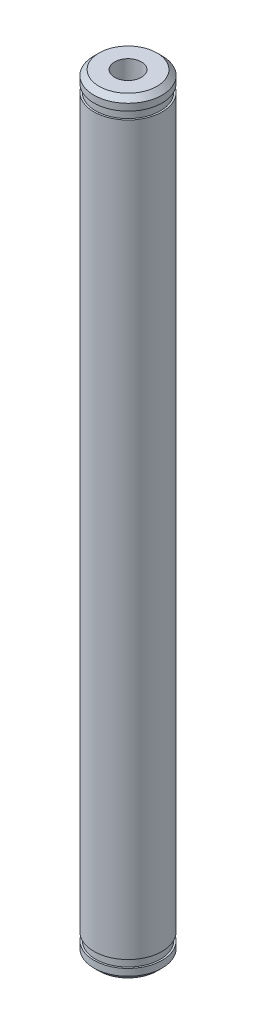
ISO-10303-21;
HEADER;
FILE_DESCRIPTION(('STEP AP214'),'2;1');
FILE_NAME('part.step','',(''),(''),'','','');
FILE_SCHEMA(('AUTOMOTIVE_DESIGN { 1 0 10303 214 1 1 1 1 }'));
ENDSEC;
DATA;
#1=APPLICATION_CONTEXT('core data for automotive mechanical design processes');
#2=APPLICATION_PROTOCOL_DEFINITION('international standard','automotive_design',2000,#1);
#3=PRODUCT_CONTEXT('',#1,'mechanical');
#4=PRODUCT('Part','Part','',(#3));
#5=PRODUCT_RELATED_PRODUCT_CATEGORY('part','',(#4));
#6=PRODUCT_DEFINITION_FORMATION('','',#4);
#7=PRODUCT_DEFINITION_CONTEXT('part definition',#1,'design');
#8=PRODUCT_DEFINITION('design','',#6,#7);
#9=PRODUCT_DEFINITION_SHAPE('','',#8);
#10=(LENGTH_UNIT() NAMED_UNIT(*) SI_UNIT(.MILLI.,.METRE.));
#11=(NAMED_UNIT(*) PLANE_ANGLE_UNIT() SI_UNIT($,.RADIAN.));
#12=(NAMED_UNIT(*) SI_UNIT($,.STERADIAN.) SOLID_ANGLE_UNIT());
#13=UNCERTAINTY_MEASURE_WITH_UNIT(LENGTH_MEASURE(1.E-05),#10,'distance_accuracy_value','');
#14=(GEOMETRIC_REPRESENTATION_CONTEXT(3) GLOBAL_UNCERTAINTY_ASSIGNED_CONTEXT((#13)) GLOBAL_UNIT_ASSIGNED_CONTEXT((#10,
#11,#12)) REPRESENTATION_CONTEXT('',''));
#15=CARTESIAN_POINT('',(0.,0.,0.));
#16=DIRECTION('',(0.,0.,1.));
#17=DIRECTION('',(1.,0.,0.));
#18=AXIS2_PLACEMENT_3D('',#15,#16,#17);
#19=CARTESIAN_POINT('',(0.,90.,0.));
#20=DIRECTION('',(0.,-1.,0.));
#21=DIRECTION('',(0.,0.,-1.));
#22=AXIS2_PLACEMENT_3D('',#19,#20,#21);
#23=CYLINDRICAL_SURFACE('',#22,4.);
#24=CARTESIAN_POINT('',(0.,2.3,0.));
#25=DIRECTION('',(0.,-1.,0.));
#26=DIRECTION('',(0.,0.,-1.));
#27=AXIS2_PLACEMENT_3D('',#24,#25,#26);
#28=CIRCLE('',#27,4.);
#29=CARTESIAN_POINT('',(0.,2.30000000000001,-4.));
#30=VERTEX_POINT('',#29);
#31=EDGE_CURVE('E70',#30,#30,#28,.T.);
#32=CARTESIAN_POINT('',(0.,87.7,0.));
#33=DIRECTION('',(0.,-1.,0.));
#34=DIRECTION('',(0.,0.,-1.));
#35=AXIS2_PLACEMENT_3D('',#32,#33,#34);
#36=CIRCLE('',#35,4.);
#37=CARTESIAN_POINT('',(0.,87.7,-4.));
#38=VERTEX_POINT('',#37);
#39=EDGE_CURVE('E94',#38,#38,#36,.T.);
#40=CARTESIAN_POINT('',(0.,2.30000000000001,-4.));
#41=CARTESIAN_POINT('',(0.,3.18958333333334,-4.));
#42=CARTESIAN_POINT('',(0.,4.07916666666668,-4.));
#43=CARTESIAN_POINT('',(0.,5.85833333333334,-4.));
#44=CARTESIAN_POINT('',(0.,6.74791666666667,-4.));
#45=CARTESIAN_POINT('',(0.,8.52708333333334,-4.));
#46=CARTESIAN_POINT('',(0.,9.41666666666667,-4.));
#47=CARTESIAN_POINT('',(0.,11.1958333333333,-4.));
#48=CARTESIAN_POINT('',(0.,12.0854166666667,-4.));
#49=CARTESIAN_POINT('',(0.,13.8645833333333,-4.));
#50=CARTESIAN_POINT('',(0.,14.7541666666667,-4.));
#51=CARTESIAN_POINT('',(0.,16.5333333333333,-4.));
#52=CARTESIAN_POINT('',(0.,17.4229166666667,-4.));
#53=CARTESIAN_POINT('',(0.,19.2020833333333,-4.));
#54=CARTESIAN_POINT('',(0.,20.0916666666667,-4.));
#55=CARTESIAN_POINT('',(0.,21.8708333333333,-4.));
#56=CARTESIAN_POINT('',(0.,22.7604166666667,-4.));
#57=CARTESIAN_POINT('',(0.,24.5395833333334,-4.));
#58=CARTESIAN_POINT('',(0.,25.4291666666667,-4.));
#59=CARTESIAN_POINT('',(0.,27.2083333333333,-4.));
#60=CARTESIAN_POINT('',(0.,28.0979166666667,-4.));
#61=CARTESIAN_POINT('',(0.,29.8770833333333,-4.));
#62=CARTESIAN_POINT('',(0.,30.7666666666667,-4.));
#63=CARTESIAN_POINT('',(0.,32.5458333333333,-4.));
#64=CARTESIAN_POINT('',(0.,33.4354166666667,-4.));
#65=CARTESIAN_POINT('',(0.,35.2145833333333,-4.));
#66=CARTESIAN_POINT('',(0.,36.1041666666667,-4.));
#67=CARTESIAN_POINT('',(0.,37.8833333333333,-4.));
#68=CARTESIAN_POINT('',(0.,38.7729166666667,-4.));
#69=CARTESIAN_POINT('',(0.,40.5520833333333,-4.));
#70=CARTESIAN_POINT('',(0.,41.4416666666667,-4.));
#71=CARTESIAN_POINT('',(0.,43.2208333333333,-4.));
#72=CARTESIAN_POINT('',(0.,44.1104166666667,-4.));
#73=CARTESIAN_POINT('',(0.,45.8895833333333,-4.));
#74=CARTESIAN_POINT('',(0.,46.7791666666667,-4.));
#75=CARTESIAN_POINT('',(0.,48.5583333333333,-4.));
#76=CARTESIAN_POINT('',(0.,49.4479166666667,-4.));
#77=CARTESIAN_POINT('',(0.,51.2270833333333,-4.));
#78=CARTESIAN_POINT('',(0.,52.1166666666667,-4.));
#79=CARTESIAN_POINT('',(0.,53.8958333333333,-4.));
#80=CARTESIAN_POINT('',(0.,54.7854166666667,-4.));
#81=CARTESIAN_POINT('',(0.,56.5645833333333,-4.));
#82=CARTESIAN_POINT('',(0.,57.4541666666667,-4.));
#83=CARTESIAN_POINT('',(0.,59.2333333333333,-4.));
#84=CARTESIAN_POINT('',(0.,60.1229166666667,-4.));
#85=CARTESIAN_POINT('',(0.,61.9020833333333,-4.));
#86=CARTESIAN_POINT('',(0.,62.7916666666667,-4.));
#87=CARTESIAN_POINT('',(0.,64.5708333333333,-4.));
#88=CARTESIAN_POINT('',(0.,65.4604166666667,-4.));
#89=CARTESIAN_POINT('',(0.,67.2395833333333,-4.));
#90=CARTESIAN_POINT('',(0.,68.1291666666667,-4.));
#91=CARTESIAN_POINT('',(0.,69.9083333333333,-4.));
#92=CARTESIAN_POINT('',(0.,70.7979166666667,-4.));
#93=CARTESIAN_POINT('',(0.,72.5770833333333,-4.));
#94=CARTESIAN_POINT('',(0.,73.4666666666667,-4.));
#95=CARTESIAN_POINT('',(0.,75.2458333333333,-4.));
#96=CARTESIAN_POINT('',(0.,76.1354166666667,-4.));
#97=CARTESIAN_POINT('',(0.,77.9145833333333,-4.));
#98=CARTESIAN_POINT('',(0.,78.8041666666667,-4.));
#99=CARTESIAN_POINT('',(0.,80.5833333333333,-4.));
#100=CARTESIAN_POINT('',(0.,81.4729166666667,-4.));
#101=CARTESIAN_POINT('',(0.,83.2520833333333,-4.));
#102=CARTESIAN_POINT('',(0.,84.1416666666667,-4.));
#103=CARTESIAN_POINT('',(0.,85.9208333333333,-4.));
#104=CARTESIAN_POINT('',(0.,86.8104166666667,-4.));
#105=CARTESIAN_POINT('',(0.,87.7,-4.));
#106=B_SPLINE_CURVE_WITH_KNOTS('',3,(#40,#41,#42,#43,#44,#45,#46,#47,#48,#49,#50,#51,#52,#53,
#54,#55,#56,#57,#58,#59,#60,#61,#62,#63,#64,#65,#66,#67,#68,#69,#70,#71,#72,#73,#74,#75,#76,#77,
#78,#79,#80,#81,#82,#83,#84,#85,#86,#87,#88,#89,#90,#91,#92,#93,#94,#95,#96,#97,#98,#99,#100,
#101,#102,#103,#104,#105),.UNSPECIFIED.,.F.,.F.,(4,2,2,2,2,2,2,2,2,2,2,2,2,2,2,2,2,2,2,2,2,2,2,
2,2,2,2,2,2,2,2,2,4),(0.,2.66875,5.3375,8.00624999999999,10.675,13.34375,16.0125,18.68125,21.35,
24.01875,26.6875,29.35625,32.025,34.69375,37.3625,40.03125,42.7,45.36875,48.0375,50.70625,
53.375,56.04375,58.7125,61.38125,64.05,66.71875,69.3875,72.05625,74.725,77.39375,80.0625,
82.73125,85.4),.UNSPECIFIED.);
#107=EDGE_CURVE('BSEAM45',#30,#38,#106,.T.);
#108=ORIENTED_EDGE('',*,*,#31,.F.);
#109=ORIENTED_EDGE('',*,*,#39,.T.);
#110=ORIENTED_EDGE('',*,*,#107,.T.);
#111=ORIENTED_EDGE('',*,*,#107,.F.);
#112=EDGE_LOOP('',(#108,#110,#109,#111));
#113=FACE_BOUND('',#112,.T.);
#114=ADVANCED_FACE('F45',(#113),#23,.T.);
#115=CARTESIAN_POINT('',(0.,2.3,0.));
#116=DIRECTION('',(0.,-1.,0.));
#117=DIRECTION('',(0.,0.,-1.));
#118=AXIS2_PLACEMENT_3D('',#115,#116,#117);
#119=PLANE('',#118);
#120=CARTESIAN_POINT('',(0.,2.3,0.));
#121=DIRECTION('',(0.,-1.,0.));
#122=DIRECTION('',(0.,0.,-1.));
#123=AXIS2_PLACEMENT_3D('',#120,#121,#122);
#124=CIRCLE('',#123,3.8);
#125=CARTESIAN_POINT('',(0.,2.3,-3.8));
#126=VERTEX_POINT('',#125);
#127=EDGE_CURVE('E75',#126,#126,#124,.T.);
#128=ORIENTED_EDGE('',*,*,#127,.F.);
#129=EDGE_LOOP('',(#128));
#130=FACE_BOUND('',#129,.T.);
#131=ORIENTED_EDGE('',*,*,#31,.T.);
#132=EDGE_LOOP('',(#131));
#133=FACE_BOUND('',#132,.T.);
#134=ADVANCED_FACE('F132',(#130,#133),#119,.T.);
#135=CARTESIAN_POINT('',(0.,1.4,0.));
#136=DIRECTION('',(0.,-1.,0.));
#137=DIRECTION('',(0.,0.,-1.));
#138=AXIS2_PLACEMENT_3D('',#135,#136,#137);
#139=PLANE('',#138);
#140=CARTESIAN_POINT('',(0.,1.4,0.));
#141=DIRECTION('',(0.,-1.,0.));
#142=DIRECTION('',(0.,0.,-1.));
#143=AXIS2_PLACEMENT_3D('',#140,#141,#142);
#144=CIRCLE('',#143,3.8);
#145=CARTESIAN_POINT('',(0.,1.4,-3.8));
#146=VERTEX_POINT('',#145);
#147=EDGE_CURVE('E79',#146,#146,#144,.T.);
#148=ORIENTED_EDGE('',*,*,#147,.T.);
#149=EDGE_LOOP('',(#148));
#150=FACE_BOUND('',#149,.T.);
#151=CARTESIAN_POINT('',(0.,1.4,0.));
#152=DIRECTION('',(0.,-1.,0.));
#153=DIRECTION('',(0.,0.,-1.));
#154=AXIS2_PLACEMENT_3D('',#151,#152,#153);
#155=CIRCLE('',#154,4.);
#156=CARTESIAN_POINT('',(0.,1.4,-4.));
#157=VERTEX_POINT('',#156);
#158=EDGE_CURVE('E71',#157,#157,#155,.T.);
#159=ORIENTED_EDGE('',*,*,#158,.F.);
#160=EDGE_LOOP('',(#159));
#161=FACE_BOUND('',#160,.T.);
#162=ADVANCED_FACE('F140',(#150,#161),#139,.F.);
#163=CARTESIAN_POINT('',(0.,2.3,0.));
#164=DIRECTION('',(0.,-1.,0.));
#165=DIRECTION('',(0.,0.,-1.));
#166=AXIS2_PLACEMENT_3D('',#163,#164,#165);
#167=CYLINDRICAL_SURFACE('',#166,3.8);
#168=ORIENTED_EDGE('',*,*,#127,.T.);
#169=EDGE_LOOP('',(#168));
#170=FACE_BOUND('',#169,.T.);
#171=ORIENTED_EDGE('',*,*,#147,.F.);
#172=EDGE_LOOP('',(#171));
#173=FACE_BOUND('',#172,.T.);
#174=ADVANCED_FACE('F164',(#170,#173),#167,.T.);
#175=CARTESIAN_POINT('',(0.,0.,0.));
#176=DIRECTION('',(0.,1.,0.));
#177=DIRECTION('',(0.,0.,1.));
#178=AXIS2_PLACEMENT_3D('',#175,#176,#177);
#179=PLANE('',#178);
#180=CARTESIAN_POINT('',(0.,0.,0.));
#181=DIRECTION('',(0.,1.,0.));
#182=DIRECTION('',(0.,0.,1.));
#183=AXIS2_PLACEMENT_3D('',#180,#181,#182);
#184=CIRCLE('',#183,3.39999999999992);
#185=CARTESIAN_POINT('',(0.,0.,3.39999999999992));
#186=VERTEX_POINT('',#185);
#187=EDGE_CURVE('E10',#186,#186,#184,.F.);
#188=ORIENTED_EDGE('',*,*,#187,.T.);
#189=EDGE_LOOP('',(#188));
#190=FACE_BOUND('',#189,.T.);
#191=ADVANCED_FACE('F156',(#190),#179,.F.);
#192=CARTESIAN_POINT('',(0.,0.600000000000087,0.));
#193=DIRECTION('',(0.,1.,0.));
#194=DIRECTION('',(0.,0.,1.));
#195=AXIS2_PLACEMENT_3D('',#192,#193,#194);
#196=CONICAL_SURFACE('',#195,4.,0.785398163397445);
#197=ORIENTED_EDGE('',*,*,#187,.F.);
#198=EDGE_LOOP('',(#197));
#199=FACE_BOUND('',#198,.T.);
#200=CARTESIAN_POINT('',(0.,0.600000000000087,0.));
#201=DIRECTION('',(0.,1.,0.));
#202=DIRECTION('',(0.,0.,1.));
#203=AXIS2_PLACEMENT_3D('',#200,#201,#202);
#204=CIRCLE('',#203,4.);
#205=CARTESIAN_POINT('',(0.,0.600000000000087,-4.));
#206=VERTEX_POINT('',#205);
#207=EDGE_CURVE('E59',#206,#206,#204,.T.);
#208=ORIENTED_EDGE('',*,*,#207,.F.);
#209=EDGE_LOOP('',(#208));
#210=FACE_BOUND('',#209,.T.);
#211=ADVANCED_FACE('F48',(#199,#210),#196,.T.);
#212=CARTESIAN_POINT('',(0.,1.4,-4.));
#213=CARTESIAN_POINT('',(0.,1.39166666666667,-4.));
#214=CARTESIAN_POINT('',(0.,1.38333333333333,-4.));
#215=CARTESIAN_POINT('',(0.,1.36666666666667,-4.));
#216=CARTESIAN_POINT('',(0.,1.35833333333334,-4.));
#217=CARTESIAN_POINT('',(0.,1.34166666666667,-4.));
#218=CARTESIAN_POINT('',(0.,1.33333333333334,-4.));
#219=CARTESIAN_POINT('',(0.,1.31666666666667,-4.));
#220=CARTESIAN_POINT('',(0.,1.30833333333334,-4.));
#221=CARTESIAN_POINT('',(0.,1.29166666666668,-4.));
#222=CARTESIAN_POINT('',(0.,1.28333333333334,-4.));
#223=CARTESIAN_POINT('',(0.,1.26666666666668,-4.));
#224=CARTESIAN_POINT('',(0.,1.25833333333335,-4.));
#225=CARTESIAN_POINT('',(0.,1.24166666666668,-4.));
#226=CARTESIAN_POINT('',(0.,1.23333333333335,-4.));
#227=CARTESIAN_POINT('',(0.,1.21666666666669,-4.));
#228=CARTESIAN_POINT('',(0.,1.20833333333335,-4.));
#229=CARTESIAN_POINT('',(0.,1.19166666666669,-4.));
#230=CARTESIAN_POINT('',(0.,1.18333333333336,-4.));
#231=CARTESIAN_POINT('',(0.,1.16666666666669,-4.));
#232=CARTESIAN_POINT('',(0.,1.15833333333336,-4.));
#233=CARTESIAN_POINT('',(0.,1.14166666666669,-4.));
#234=CARTESIAN_POINT('',(0.,1.13333333333336,-4.));
#235=CARTESIAN_POINT('',(0.,1.1166666666667,-4.));
#236=CARTESIAN_POINT('',(0.,1.10833333333336,-4.));
#237=CARTESIAN_POINT('',(0.,1.0916666666667,-4.));
#238=CARTESIAN_POINT('',(0.,1.08333333333337,-4.));
#239=CARTESIAN_POINT('',(0.,1.0666666666667,-4.));
#240=CARTESIAN_POINT('',(0.,1.05833333333337,-4.));
#241=CARTESIAN_POINT('',(0.,1.0416666666667,-4.));
#242=CARTESIAN_POINT('',(0.,1.03333333333337,-4.));
#243=CARTESIAN_POINT('',(0.,1.01666666666671,-4.));
#244=CARTESIAN_POINT('',(0.,1.00833333333338,-4.));
#245=CARTESIAN_POINT('',(0.,0.99166666666671,-4.));
#246=CARTESIAN_POINT('',(0.,0.983333333333378,-4.));
#247=CARTESIAN_POINT('',(0.,0.966666666666713,-4.));
#248=CARTESIAN_POINT('',(0.,0.95833333333338,-4.));
#249=CARTESIAN_POINT('',(0.,0.941666666666716,-4.));
#250=CARTESIAN_POINT('',(0.,0.933333333333383,-4.));
#251=CARTESIAN_POINT('',(0.,0.916666666666718,-4.));
#252=CARTESIAN_POINT('',(0.,0.908333333333386,-4.));
#253=CARTESIAN_POINT('',(0.,0.891666666666721,-4.));
#254=CARTESIAN_POINT('',(0.,0.883333333333389,-4.));
#255=CARTESIAN_POINT('',(0.,0.866666666666724,-4.));
#256=CARTESIAN_POINT('',(0.,0.858333333333391,-4.));
#257=CARTESIAN_POINT('',(0.,0.841666666666727,-4.));
#258=CARTESIAN_POINT('',(0.,0.833333333333394,-4.));
#259=CARTESIAN_POINT('',(0.,0.816666666666729,-4.));
#260=CARTESIAN_POINT('',(0.,0.808333333333397,-4.));
#261=CARTESIAN_POINT('',(0.,0.791666666666732,-4.));
#262=CARTESIAN_POINT('',(0.,0.7833333333334,-4.));
#263=CARTESIAN_POINT('',(0.,0.766666666666735,-4.));
#264=CARTESIAN_POINT('',(0.,0.758333333333402,-4.));
#265=CARTESIAN_POINT('',(0.,0.741666666666738,-4.));
#266=CARTESIAN_POINT('',(0.,0.733333333333405,-4.));
#267=CARTESIAN_POINT('',(0.,0.71666666666674,-4.));
#268=CARTESIAN_POINT('',(0.,0.708333333333408,-4.));
#269=CARTESIAN_POINT('',(0.,0.691666666666743,-4.));
#270=CARTESIAN_POINT('',(0.,0.683333333333411,-4.));
#271=CARTESIAN_POINT('',(0.,0.666666666666746,-4.));
#272=CARTESIAN_POINT('',(0.,0.658333333333413,-4.));
#273=CARTESIAN_POINT('',(0.,0.641666666666749,-4.));
#274=CARTESIAN_POINT('',(0.,0.633333333333416,-4.));
#275=CARTESIAN_POINT('',(0.,0.616666666666751,-4.));
#276=CARTESIAN_POINT('',(0.,0.608333333333419,-4.));
#277=CARTESIAN_POINT('',(0.,0.600000000000087,-4.));
#278=B_SPLINE_CURVE_WITH_KNOTS('',3,(#212,#213,#214,#215,#216,#217,#218,#219,#220,#221,#222,
#223,#224,#225,#226,#227,#228,#229,#230,#231,#232,#233,#234,#235,#236,#237,#238,#239,#240,#241,
#242,#243,#244,#245,#246,#247,#248,#249,#250,#251,#252,#253,#254,#255,#256,#257,#258,#259,#260,
#261,#262,#263,#264,#265,#266,#267,#268,#269,#270,#271,#272,#273,#274,#275,#276,#277),
.UNSPECIFIED.,.F.,.F.,(4,2,2,2,2,2,2,2,2,2,2,2,2,2,2,2,2,2,2,2,2,2,2,2,2,2,2,2,2,2,2,2,4),(0.,
0.0249999999999972,0.0499999999999945,0.0749999999999917,0.099999999999989,0.124999999999986,
0.149999999999983,0.174999999999981,0.199999999999978,0.224999999999975,0.249999999999972,
0.27499999999997,0.299999999999967,0.324999999999964,0.349999999999961,0.374999999999959,
0.399999999999956,0.424999999999953,0.44999999999995,0.474999999999948,0.499999999999945,
0.524999999999942,0.549999999999939,0.574999999999937,0.599999999999934,0.624999999999931,
0.649999999999928,0.674999999999926,0.699999999999923,0.72499999999992,0.749999999999917,
0.774999999999915,0.799999999999912),.UNSPECIFIED.);
#279=EDGE_CURVE('BSEAM127',#157,#206,#278,.T.);
#280=ORIENTED_EDGE('',*,*,#158,.T.);
#281=ORIENTED_EDGE('',*,*,#207,.T.);
#282=ORIENTED_EDGE('',*,*,#279,.T.);
#283=ORIENTED_EDGE('',*,*,#279,.F.);
#284=EDGE_LOOP('',(#280,#282,#281,#283));
#285=FACE_BOUND('',#284,.T.);
#286=ADVANCED_FACE('F127',(#285),#23,.T.);
#287=CARTESIAN_POINT('',(0.,87.7,0.));
#288=DIRECTION('',(0.,1.,0.));
#289=DIRECTION('',(0.,0.,-1.));
#290=AXIS2_PLACEMENT_3D('',#287,#288,#289);
#291=PLANE('',#290);
#292=ORIENTED_EDGE('',*,*,#39,.F.);
#293=EDGE_LOOP('',(#292));
#294=FACE_BOUND('',#293,.T.);
#295=CARTESIAN_POINT('',(0.,87.7,0.));
#296=DIRECTION('',(0.,-1.,0.));
#297=DIRECTION('',(0.,0.,-1.));
#298=AXIS2_PLACEMENT_3D('',#295,#296,#297);
#299=CIRCLE('',#298,3.8);
#300=CARTESIAN_POINT('',(0.,87.7,-3.8));
#301=VERTEX_POINT('',#300);
#302=EDGE_CURVE('E99',#301,#301,#299,.T.);
#303=ORIENTED_EDGE('',*,*,#302,.T.);
#304=EDGE_LOOP('',(#303));
#305=FACE_BOUND('',#304,.T.);
#306=ADVANCED_FACE('F111',(#294,#305),#291,.T.);
#307=CARTESIAN_POINT('',(0.,88.6,0.));
#308=DIRECTION('',(0.,1.,0.));
#309=DIRECTION('',(0.,0.,-1.));
#310=AXIS2_PLACEMENT_3D('',#307,#308,#309);
#311=PLANE('',#310);
#312=CARTESIAN_POINT('',(0.,88.6,0.));
#313=DIRECTION('',(0.,-1.,0.));
#314=DIRECTION('',(0.,0.,-1.));
#315=AXIS2_PLACEMENT_3D('',#312,#313,#314);
#316=CIRCLE('',#315,4.);
#317=CARTESIAN_POINT('',(0.,88.6,-4.));
#318=VERTEX_POINT('',#317);
#319=EDGE_CURVE('E95',#318,#318,#316,.T.);
#320=ORIENTED_EDGE('',*,*,#319,.T.);
#321=EDGE_LOOP('',(#320));
#322=FACE_BOUND('',#321,.T.);
#323=CARTESIAN_POINT('',(0.,88.6,0.));
#324=DIRECTION('',(0.,-1.,0.));
#325=DIRECTION('',(0.,0.,-1.));
#326=AXIS2_PLACEMENT_3D('',#323,#324,#325);
#327=CIRCLE('',#326,3.8);
#328=CARTESIAN_POINT('',(0.,88.6,-3.8));
#329=VERTEX_POINT('',#328);
#330=EDGE_CURVE('E103',#329,#329,#327,.T.);
#331=ORIENTED_EDGE('',*,*,#330,.F.);
#332=EDGE_LOOP('',(#331));
#333=FACE_BOUND('',#332,.T.);
#334=ADVANCED_FACE('F117',(#322,#333),#311,.F.);
#335=CARTESIAN_POINT('',(0.,87.7,0.));
#336=DIRECTION('',(0.,1.,0.));
#337=DIRECTION('',(0.,0.,1.));
#338=AXIS2_PLACEMENT_3D('',#335,#336,#337);
#339=CYLINDRICAL_SURFACE('',#338,3.8);
#340=ORIENTED_EDGE('',*,*,#302,.F.);
#341=EDGE_LOOP('',(#340));
#342=FACE_BOUND('',#341,.T.);
#343=ORIENTED_EDGE('',*,*,#330,.T.);
#344=EDGE_LOOP('',(#343));
#345=FACE_BOUND('',#344,.T.);
#346=ADVANCED_FACE('F113',(#342,#345),#339,.T.);
#347=CARTESIAN_POINT('',(0.,84.,0.));
#348=DIRECTION('',(0.,-1.,0.));
#349=DIRECTION('',(0.,0.,-1.));
#350=AXIS2_PLACEMENT_3D('',#347,#348,#349);
#351=PLANE('',#350);
#352=CARTESIAN_POINT('',(0.,84.,0.));
#353=DIRECTION('',(0.,1.,0.));
#354=DIRECTION('',(0.,0.,1.));
#355=AXIS2_PLACEMENT_3D('',#352,#353,#354);
#356=CIRCLE('',#355,1.575);
#357=CARTESIAN_POINT('',(0.,84.,1.575));
#358=VERTEX_POINT('',#357);
#359=EDGE_CURVE('E83',#358,#358,#356,.T.);
#360=ORIENTED_EDGE('',*,*,#359,.T.);
#361=EDGE_LOOP('',(#360));
#362=FACE_BOUND('',#361,.T.);
#363=ADVANCED_FACE('F116',(#362),#351,.F.);
#364=CARTESIAN_POINT('',(0.,90.,0.));
#365=DIRECTION('',(0.,1.,0.));
#366=DIRECTION('',(0.,0.,1.));
#367=AXIS2_PLACEMENT_3D('',#364,#365,#366);
#368=CYLINDRICAL_SURFACE('',#367,1.575);
#369=ORIENTED_EDGE('',*,*,#359,.F.);
#370=EDGE_LOOP('',(#369));
#371=FACE_BOUND('',#370,.T.);
#372=CARTESIAN_POINT('',(0.,90.,0.));
#373=DIRECTION('',(0.,1.,0.));
#374=DIRECTION('',(0.,0.,1.));
#375=AXIS2_PLACEMENT_3D('',#372,#373,#374);
#376=CIRCLE('',#375,1.575);
#377=CARTESIAN_POINT('',(0.,90.,1.575));
#378=VERTEX_POINT('',#377);
#379=EDGE_CURVE('E90',#378,#378,#376,.T.);
#380=ORIENTED_EDGE('',*,*,#379,.T.);
#381=EDGE_LOOP('',(#380));
#382=FACE_BOUND('',#381,.T.);
#383=ADVANCED_FACE('F173',(#371,#382),#368,.F.);
#384=CARTESIAN_POINT('',(0.,90.,0.));
#385=DIRECTION('',(0.,1.,0.));
#386=DIRECTION('',(0.,0.,1.));
#387=AXIS2_PLACEMENT_3D('',#384,#385,#386);
#388=PLANE('',#387);
#389=ORIENTED_EDGE('',*,*,#379,.F.);
#390=EDGE_LOOP('',(#389));
#391=FACE_BOUND('',#390,.T.);
#392=CARTESIAN_POINT('',(0.,90.,0.));
#393=DIRECTION('',(0.,1.,0.));
#394=DIRECTION('',(0.,0.,1.));
#395=AXIS2_PLACEMENT_3D('',#392,#393,#394);
#396=CIRCLE('',#395,3.40000000000004);
#397=CARTESIAN_POINT('',(0.,90.,-3.40000000000005));
#398=VERTEX_POINT('',#397);
#399=EDGE_CURVE('E64',#398,#398,#396,.T.);
#400=ORIENTED_EDGE('',*,*,#399,.T.);
#401=EDGE_LOOP('',(#400));
#402=FACE_BOUND('',#401,.T.);
#403=ADVANCED_FACE('F172',(#391,#402),#388,.T.);
#404=CARTESIAN_POINT('',(0.,90.,0.));
#405=DIRECTION('',(0.,-1.,0.));
#406=DIRECTION('',(0.,0.,-1.));
#407=AXIS2_PLACEMENT_3D('',#404,#405,#406);
#408=CONICAL_SURFACE('',#407,3.40000000000004,0.785398163397457);
#409=CARTESIAN_POINT('',(0.,89.4,0.));
#410=DIRECTION('',(0.,1.,0.));
#411=DIRECTION('',(0.,0.,1.));
#412=AXIS2_PLACEMENT_3D('',#409,#410,#411);
#413=CIRCLE('',#412,4.);
#414=CARTESIAN_POINT('',(0.,89.4,-4.00000000000001));
#415=VERTEX_POINT('',#414);
#416=EDGE_CURVE('E54',#415,#415,#413,.F.);
#417=CARTESIAN_POINT('',(0.,89.4,-4.00000000000001));
#418=CARTESIAN_POINT('',(0.,89.40625,-3.99375000000001));
#419=CARTESIAN_POINT('',(0.,89.4125000000001,-3.98750000000001));
#420=CARTESIAN_POINT('',(0.,89.425,-3.97500000000001));
#421=CARTESIAN_POINT('',(0.,89.43125,-3.96875000000001));
#422=CARTESIAN_POINT('',(0.,89.4437500000001,-3.95625000000001));
#423=CARTESIAN_POINT('',(0.,89.45,-3.95000000000001));
#424=CARTESIAN_POINT('',(0.,89.4625,-3.93750000000001));
#425=CARTESIAN_POINT('',(0.,89.46875,-3.93125000000001));
#426=CARTESIAN_POINT('',(0.,89.48125,-3.91875000000001));
#427=CARTESIAN_POINT('',(0.,89.4875,-3.91250000000001));
#428=CARTESIAN_POINT('',(0.,89.5,-3.90000000000001));
#429=CARTESIAN_POINT('',(0.,89.50625,-3.89375000000001));
#430=CARTESIAN_POINT('',(0.,89.51875,-3.88125000000001));
#431=CARTESIAN_POINT('',(0.,89.525,-3.87500000000002));
#432=CARTESIAN_POINT('',(0.,89.5375,-3.86250000000002));
#433=CARTESIAN_POINT('',(0.,89.54375,-3.85625000000002));
#434=CARTESIAN_POINT('',(0.,89.55625,-3.84375000000002));
#435=CARTESIAN_POINT('',(0.,89.5625,-3.83750000000002));
#436=CARTESIAN_POINT('',(0.,89.575,-3.82500000000002));
#437=CARTESIAN_POINT('',(0.,89.58125,-3.81875000000002));
#438=CARTESIAN_POINT('',(0.,89.59375,-3.80625000000002));
#439=CARTESIAN_POINT('',(0.,89.6,-3.80000000000002));
#440=CARTESIAN_POINT('',(0.,89.6125,-3.78750000000002));
#441=CARTESIAN_POINT('',(0.,89.61875,-3.78125000000002));
#442=CARTESIAN_POINT('',(0.,89.63125,-3.76875000000002));
#443=CARTESIAN_POINT('',(0.,89.6375,-3.76250000000002));
#444=CARTESIAN_POINT('',(0.,89.65,-3.75000000000002));
#445=CARTESIAN_POINT('',(0.,89.65625,-3.74375000000002));
#446=CARTESIAN_POINT('',(0.,89.66875,-3.73125000000003));
#447=CARTESIAN_POINT('',(0.,89.675,-3.72500000000003));
#448=CARTESIAN_POINT('',(0.,89.6875,-3.71250000000003));
#449=CARTESIAN_POINT('',(0.,89.69375,-3.70625000000003));
#450=CARTESIAN_POINT('',(0.,89.70625,-3.69375000000003));
#451=CARTESIAN_POINT('',(0.,89.7125,-3.68750000000003));
#452=CARTESIAN_POINT('',(0.,89.725,-3.67500000000003));
#453=CARTESIAN_POINT('',(0.,89.73125,-3.66875000000003));
#454=CARTESIAN_POINT('',(0.,89.74375,-3.65625000000003));
#455=CARTESIAN_POINT('',(0.,89.75,-3.65000000000003));
#456=CARTESIAN_POINT('',(0.,89.7625,-3.63750000000003));
#457=CARTESIAN_POINT('',(0.,89.76875,-3.63125000000003));
#458=CARTESIAN_POINT('',(0.,89.78125,-3.61875000000003));
#459=CARTESIAN_POINT('',(0.,89.7875,-3.61250000000003));
#460=CARTESIAN_POINT('',(0.,89.8,-3.60000000000003));
#461=CARTESIAN_POINT('',(0.,89.80625,-3.59375000000003));
#462=CARTESIAN_POINT('',(0.,89.81875,-3.58125000000004));
#463=CARTESIAN_POINT('',(0.,89.825,-3.57500000000004));
#464=CARTESIAN_POINT('',(0.,89.8375,-3.56250000000004));
#465=CARTESIAN_POINT('',(0.,89.84375,-3.55625000000004));
#466=CARTESIAN_POINT('',(0.,89.85625,-3.54375000000004));
#467=CARTESIAN_POINT('',(0.,89.8625,-3.53750000000004));
#468=CARTESIAN_POINT('',(0.,89.875,-3.52500000000004));
#469=CARTESIAN_POINT('',(0.,89.88125,-3.51875000000004));
#470=CARTESIAN_POINT('',(0.,89.89375,-3.50625000000004));
#471=CARTESIAN_POINT('',(0.,89.9,-3.50000000000004));
#472=CARTESIAN_POINT('',(0.,89.9125,-3.48750000000004));
#473=CARTESIAN_POINT('',(0.,89.91875,-3.48125000000004));
#474=CARTESIAN_POINT('',(0.,89.93125,-3.46875000000004));
#475=CARTESIAN_POINT('',(0.,89.9375,-3.46250000000004));
#476=CARTESIAN_POINT('',(0.,89.95,-3.45000000000004));
#477=CARTESIAN_POINT('',(0.,89.95625,-3.44375000000005));
#478=CARTESIAN_POINT('',(0.,89.96875,-3.43125000000005));
#479=CARTESIAN_POINT('',(0.,89.975,-3.42500000000005));
#480=CARTESIAN_POINT('',(0.,89.9875,-3.41250000000005));
#481=CARTESIAN_POINT('',(0.,89.99375,-3.40625000000005));
#482=CARTESIAN_POINT('',(0.,90.,-3.40000000000005));
#483=B_SPLINE_CURVE_WITH_KNOTS('',3,(#417,#418,#419,#420,#421,#422,#423,#424,#425,#426,#427,
#428,#429,#430,#431,#432,#433,#434,#435,#436,#437,#438,#439,#440,#441,#442,#443,#444,#445,#446,
#447,#448,#449,#450,#451,#452,#453,#454,#455,#456,#457,#458,#459,#460,#461,#462,#463,#464,#465,
#466,#467,#468,#469,#470,#471,#472,#473,#474,#475,#476,#477,#478,#479,#480,#481,#482),
.UNSPECIFIED.,.F.,.F.,(4,2,2,2,2,2,2,2,2,2,2,2,2,2,2,2,2,2,2,2,2,2,2,2,2,2,2,2,2,2,2,2,4),(0.,
0.0265165042944932,0.0530330085889865,0.0795495128834797,0.106066017177972,0.132582521472466,
0.159099025766959,0.185615530061452,0.212132034355945,0.238648538650438,0.265165042944932,
0.291681547239425,0.318198051533918,0.344714555828411,0.371231060122904,0.397747564417397,
0.42426406871189,0.450780573006384,0.477297077300877,0.50381358159537,0.530330085889863,
0.556846590184356,0.583363094478849,0.609879598773342,0.636396103067836,0.662912607362329,
0.689429111656822,0.715945615951315,0.742462120245808,0.768978624540301,0.795495128834794,
0.822011633129287,0.848528137423791),.UNSPECIFIED.);
#484=EDGE_CURVE('BSEAM147',#415,#398,#483,.T.);
#485=ORIENTED_EDGE('',*,*,#416,.F.);
#486=ORIENTED_EDGE('',*,*,#399,.F.);
#487=ORIENTED_EDGE('',*,*,#484,.T.);
#488=ORIENTED_EDGE('',*,*,#484,.F.);
#489=EDGE_LOOP('',(#485,#487,#486,#488));
#490=FACE_BOUND('',#489,.T.);
#491=ADVANCED_FACE('F147',(#490),#408,.T.);
#492=CARTESIAN_POINT('',(0.,88.6,-4.));
#493=CARTESIAN_POINT('',(0.,88.6083333333333,-4.));
#494=CARTESIAN_POINT('',(0.,88.6166666666667,-4.));
#495=CARTESIAN_POINT('',(0.,88.6333333333333,-4.));
#496=CARTESIAN_POINT('',(0.,88.6416666666667,-4.));
#497=CARTESIAN_POINT('',(0.,88.6583333333333,-4.));
#498=CARTESIAN_POINT('',(0.,88.6666666666667,-4.));
#499=CARTESIAN_POINT('',(0.,88.6833333333333,-4.));
#500=CARTESIAN_POINT('',(0.,88.6916666666667,-4.));
#501=CARTESIAN_POINT('',(0.,88.7083333333333,-4.));
#502=CARTESIAN_POINT('',(0.,88.7166666666667,-4.));
#503=CARTESIAN_POINT('',(0.,88.7333333333333,-4.));
#504=CARTESIAN_POINT('',(0.,88.7416666666667,-4.));
#505=CARTESIAN_POINT('',(0.,88.7583333333333,-4.));
#506=CARTESIAN_POINT('',(0.,88.7666666666667,-4.));
#507=CARTESIAN_POINT('',(0.,88.7833333333333,-4.));
#508=CARTESIAN_POINT('',(0.,88.7916666666667,-4.));
#509=CARTESIAN_POINT('',(0.,88.8083333333334,-4.));
#510=CARTESIAN_POINT('',(0.,88.8166666666667,-4.));
#511=CARTESIAN_POINT('',(0.,88.8333333333333,-4.));
#512=CARTESIAN_POINT('',(0.,88.8416666666667,-4.));
#513=CARTESIAN_POINT('',(0.,88.8583333333333,-4.));
#514=CARTESIAN_POINT('',(0.,88.8666666666667,-4.));
#515=CARTESIAN_POINT('',(0.,88.8833333333334,-4.));
#516=CARTESIAN_POINT('',(0.,88.8916666666667,-4.));
#517=CARTESIAN_POINT('',(0.,88.9083333333334,-4.));
#518=CARTESIAN_POINT('',(0.,88.9166666666667,-4.));
#519=CARTESIAN_POINT('',(0.,88.9333333333334,-4.));
#520=CARTESIAN_POINT('',(0.,88.9416666666667,-4.));
#521=CARTESIAN_POINT('',(0.,88.9583333333333,-4.));
#522=CARTESIAN_POINT('',(0.,88.9666666666667,-4.));
#523=CARTESIAN_POINT('',(0.,88.9833333333334,-4.));
#524=CARTESIAN_POINT('',(0.,88.9916666666667,-4.));
#525=CARTESIAN_POINT('',(0.,89.0083333333334,-4.));
#526=CARTESIAN_POINT('',(0.,89.0166666666667,-4.));
#527=CARTESIAN_POINT('',(0.,89.0333333333334,-4.));
#528=CARTESIAN_POINT('',(0.,89.0416666666667,-4.));
#529=CARTESIAN_POINT('',(0.,89.0583333333334,-4.));
#530=CARTESIAN_POINT('',(0.,89.0666666666667,-4.));
#531=CARTESIAN_POINT('',(0.,89.0833333333334,-4.));
#532=CARTESIAN_POINT('',(0.,89.0916666666667,-4.));
#533=CARTESIAN_POINT('',(0.,89.1083333333334,-4.));
#534=CARTESIAN_POINT('',(0.,89.1166666666667,-4.));
#535=CARTESIAN_POINT('',(0.,89.1333333333334,-4.));
#536=CARTESIAN_POINT('',(0.,89.1416666666667,-4.));
#537=CARTESIAN_POINT('',(0.,89.1583333333334,-4.));
#538=CARTESIAN_POINT('',(0.,89.1666666666667,-4.));
#539=CARTESIAN_POINT('',(0.,89.1833333333334,-4.));
#540=CARTESIAN_POINT('',(0.,89.1916666666667,-4.));
#541=CARTESIAN_POINT('',(0.,89.2083333333334,-4.));
#542=CARTESIAN_POINT('',(0.,89.2166666666667,-4.));
#543=CARTESIAN_POINT('',(0.,89.2333333333334,-4.));
#544=CARTESIAN_POINT('',(0.,89.2416666666667,-4.));
#545=CARTESIAN_POINT('',(0.,89.2583333333334,-4.));
#546=CARTESIAN_POINT('',(0.,89.2666666666667,-4.));
#547=CARTESIAN_POINT('',(0.,89.2833333333334,-4.));
#548=CARTESIAN_POINT('',(0.,89.2916666666667,-4.));
#549=CARTESIAN_POINT('',(0.,89.3083333333334,-4.));
#550=CARTESIAN_POINT('',(0.,89.3166666666667,-4.));
#551=CARTESIAN_POINT('',(0.,89.3333333333334,-4.));
#552=CARTESIAN_POINT('',(0.,89.3416666666667,-4.));
#553=CARTESIAN_POINT('',(0.,89.3583333333334,-4.));
#554=CARTESIAN_POINT('',(0.,89.3666666666667,-4.));
#555=CARTESIAN_POINT('',(0.,89.3833333333334,-4.));
#556=CARTESIAN_POINT('',(0.,89.3916666666667,-4.));
#557=CARTESIAN_POINT('',(0.,89.4,-4.));
#558=B_SPLINE_CURVE_WITH_KNOTS('',3,(#492,#493,#494,#495,#496,#497,#498,#499,#500,#501,#502,
#503,#504,#505,#506,#507,#508,#509,#510,#511,#512,#513,#514,#515,#516,#517,#518,#519,#520,#521,
#522,#523,#524,#525,#526,#527,#528,#529,#530,#531,#532,#533,#534,#535,#536,#537,#538,#539,#540,
#541,#542,#543,#544,#545,#546,#547,#548,#549,#550,#551,#552,#553,#554,#555,#556,#557),
.UNSPECIFIED.,.F.,.F.,(4,2,2,2,2,2,2,2,2,2,2,2,2,2,2,2,2,2,2,2,2,2,2,2,2,2,2,2,2,2,2,2,4),(0.,
0.0250000000000111,0.0500000000000084,0.0750000000000056,0.100000000000017,0.125000000000014,
0.150000000000011,0.175000000000008,0.20000000000002,0.225000000000017,0.250000000000014,
0.275000000000025,0.300000000000022,0.32500000000002,0.350000000000017,0.375000000000028,
0.400000000000025,0.425000000000023,0.450000000000034,0.475000000000031,0.500000000000028,
0.525000000000025,0.550000000000037,0.575000000000034,0.600000000000031,0.625000000000042,
0.650000000000039,0.675000000000037,0.700000000000034,0.725000000000045,0.750000000000042,
0.77500000000004,0.800000000000051),.UNSPECIFIED.);
#559=EDGE_CURVE('BSEAM135',#318,#415,#558,.T.);
#560=ORIENTED_EDGE('',*,*,#319,.F.);
#561=ORIENTED_EDGE('',*,*,#416,.T.);
#562=ORIENTED_EDGE('',*,*,#559,.T.);
#563=ORIENTED_EDGE('',*,*,#559,.F.);
#564=EDGE_LOOP('',(#560,#562,#561,#563));
#565=FACE_BOUND('',#564,.T.);
#566=ADVANCED_FACE('F135',(#565),#23,.T.);
#567=CLOSED_SHELL('',(#114,#134,#162,#174,#191,#211,#286,#306,#334,#346,#363,#383,#403,#491,#566));
#568=MANIFOLD_SOLID_BREP('B2',#567);
#569=ADVANCED_BREP_SHAPE_REPRESENTATION('',(#18,#568),#14);
#570=SHAPE_DEFINITION_REPRESENTATION(#9,#569);
ENDSEC;
END-ISO-10303-21;
